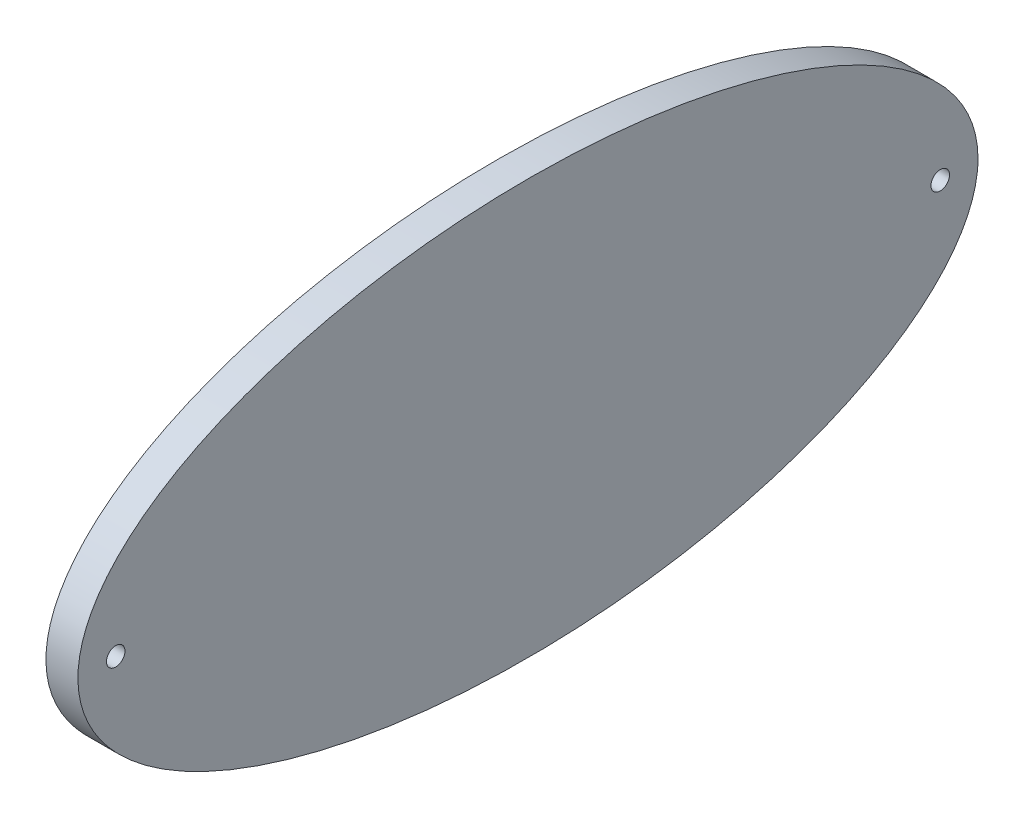
ISO-10303-21;
HEADER;
FILE_DESCRIPTION(('STEP AP214'),'2;1');
FILE_NAME('part.step','',(''),(''),'','','');
FILE_SCHEMA(('AUTOMOTIVE_DESIGN { 1 0 10303 214 1 1 1 1 }'));
ENDSEC;
DATA;
#1=APPLICATION_CONTEXT('core data for automotive mechanical design processes');
#2=APPLICATION_PROTOCOL_DEFINITION('international standard','automotive_design',2000,#1);
#3=PRODUCT_CONTEXT('',#1,'mechanical');
#4=PRODUCT('Part','Part','',(#3));
#5=PRODUCT_RELATED_PRODUCT_CATEGORY('part','',(#4));
#6=PRODUCT_DEFINITION_FORMATION('','',#4);
#7=PRODUCT_DEFINITION_CONTEXT('part definition',#1,'design');
#8=PRODUCT_DEFINITION('design','',#6,#7);
#9=PRODUCT_DEFINITION_SHAPE('','',#8);
#10=(LENGTH_UNIT() NAMED_UNIT(*) SI_UNIT(.MILLI.,.METRE.));
#11=(NAMED_UNIT(*) PLANE_ANGLE_UNIT() SI_UNIT($,.RADIAN.));
#12=(NAMED_UNIT(*) SI_UNIT($,.STERADIAN.) SOLID_ANGLE_UNIT());
#13=UNCERTAINTY_MEASURE_WITH_UNIT(LENGTH_MEASURE(1.E-05),#10,'distance_accuracy_value','');
#14=(GEOMETRIC_REPRESENTATION_CONTEXT(3) GLOBAL_UNCERTAINTY_ASSIGNED_CONTEXT((#13)) GLOBAL_UNIT_ASSIGNED_CONTEXT((#10,
#11,#12)) REPRESENTATION_CONTEXT('',''));
#15=CARTESIAN_POINT('',(0.,0.,0.));
#16=DIRECTION('',(0.,0.,1.));
#17=DIRECTION('',(1.,0.,0.));
#18=AXIS2_PLACEMENT_3D('',#15,#16,#17);
#19=CARTESIAN_POINT('',(5.08,0.,0.));
#20=DIRECTION('',(1.,0.,0.));
#21=DIRECTION('',(0.,0.,-1.));
#22=AXIS2_PLACEMENT_3D('',#19,#20,#21);
#23=PLANE('',#22);
#24=CARTESIAN_POINT('',(5.08,0.,65.5));
#25=DIRECTION('',(1.,0.,0.));
#26=DIRECTION('',(0.,0.,-1.));
#27=AXIS2_PLACEMENT_3D('',#24,#25,#26);
#28=CIRCLE('',#27,1.4732);
#29=CARTESIAN_POINT('',(5.08,0.,64.0268));
#30=VERTEX_POINT('',#29);
#31=EDGE_CURVE('E42',#30,#30,#28,.T.);
#32=ORIENTED_EDGE('',*,*,#31,.F.);
#33=EDGE_LOOP('',(#32));
#34=FACE_BOUND('',#33,.T.);
#35=CARTESIAN_POINT('',(5.08,0.,0.));
#36=DIRECTION('',(1.,0.,0.));
#37=DIRECTION('',(0.,0.,-1.));
#38=AXIS2_PLACEMENT_3D('',#35,#36,#37);
#39=ELLIPSE('',#38,71.5,32.95);
#40=CARTESIAN_POINT('',(5.08,0.,-71.5));
#41=VERTEX_POINT('',#40);
#42=EDGE_CURVE('E10',#41,#41,#39,.T.);
#43=ORIENTED_EDGE('',*,*,#42,.T.);
#44=EDGE_LOOP('',(#43));
#45=FACE_BOUND('',#44,.T.);
#46=CARTESIAN_POINT('',(5.08,0.,-65.5));
#47=DIRECTION('',(1.,0.,0.));
#48=DIRECTION('',(0.,0.,-1.));
#49=AXIS2_PLACEMENT_3D('',#46,#47,#48);
#50=CIRCLE('',#49,1.47320000000001);
#51=CARTESIAN_POINT('',(5.08,0.,-66.9732));
#52=VERTEX_POINT('',#51);
#53=EDGE_CURVE('E48',#52,#52,#50,.T.);
#54=ORIENTED_EDGE('',*,*,#53,.F.);
#55=EDGE_LOOP('',(#54));
#56=FACE_BOUND('',#55,.T.);
#57=ADVANCED_FACE('F31',(#34,#45,#56),#23,.T.);
#58=CARTESIAN_POINT('',(0.,0.,0.));
#59=DIRECTION('',(1.,0.,0.));
#60=DIRECTION('',(0.,0.,-1.));
#61=AXIS2_PLACEMENT_3D('',#58,#59,#60);
#62=PLANE('',#61);
#63=CARTESIAN_POINT('',(0.,0.,0.));
#64=DIRECTION('',(1.,0.,0.));
#65=DIRECTION('',(0.,0.,-1.));
#66=AXIS2_PLACEMENT_3D('',#63,#64,#65);
#67=ELLIPSE('',#66,71.5,32.95);
#68=CARTESIAN_POINT('',(0.,0.,-71.5));
#69=VERTEX_POINT('',#68);
#70=EDGE_CURVE('E36',#69,#69,#67,.T.);
#71=ORIENTED_EDGE('',*,*,#70,.F.);
#72=EDGE_LOOP('',(#71));
#73=FACE_BOUND('',#72,.T.);
#74=CARTESIAN_POINT('',(0.,0.,65.5));
#75=DIRECTION('',(1.,0.,0.));
#76=DIRECTION('',(0.,0.,-1.));
#77=AXIS2_PLACEMENT_3D('',#74,#75,#76);
#78=CIRCLE('',#77,1.4732);
#79=CARTESIAN_POINT('',(0.,0.,64.0268));
#80=VERTEX_POINT('',#79);
#81=EDGE_CURVE('E45',#80,#80,#78,.T.);
#82=ORIENTED_EDGE('',*,*,#81,.T.);
#83=EDGE_LOOP('',(#82));
#84=FACE_BOUND('',#83,.T.);
#85=CARTESIAN_POINT('',(0.,0.,-65.5));
#86=DIRECTION('',(1.,0.,0.));
#87=DIRECTION('',(0.,0.,-1.));
#88=AXIS2_PLACEMENT_3D('',#85,#86,#87);
#89=CIRCLE('',#88,1.47320000000001);
#90=CARTESIAN_POINT('',(0.,0.,-66.9732));
#91=VERTEX_POINT('',#90);
#92=EDGE_CURVE('E51',#91,#91,#89,.T.);
#93=ORIENTED_EDGE('',*,*,#92,.T.);
#94=EDGE_LOOP('',(#93));
#95=FACE_BOUND('',#94,.T.);
#96=ADVANCED_FACE('F61',(#73,#84,#95),#62,.F.);
#97=DIRECTION('',(-1.,0.,0.));
#98=VECTOR('',#97,1.);
#99=SURFACE_OF_LINEAR_EXTRUSION('',#39,#98);
#100=ORIENTED_EDGE('',*,*,#42,.F.);
#101=EDGE_LOOP('',(#100));
#102=FACE_BOUND('',#101,.T.);
#103=ORIENTED_EDGE('',*,*,#70,.T.);
#104=EDGE_LOOP('',(#103));
#105=FACE_BOUND('',#104,.T.);
#106=ADVANCED_FACE('F33',(#102,#105),#99,.F.);
#107=CARTESIAN_POINT('',(5.08,0.,65.5));
#108=DIRECTION('',(-1.,0.,0.));
#109=DIRECTION('',(0.,0.,1.));
#110=AXIS2_PLACEMENT_3D('',#107,#108,#109);
#111=CYLINDRICAL_SURFACE('',#110,1.4732);
#112=ORIENTED_EDGE('',*,*,#31,.T.);
#113=EDGE_LOOP('',(#112));
#114=FACE_BOUND('',#113,.T.);
#115=ORIENTED_EDGE('',*,*,#81,.F.);
#116=EDGE_LOOP('',(#115));
#117=FACE_BOUND('',#116,.T.);
#118=ADVANCED_FACE('F70',(#114,#117),#111,.F.);
#119=CARTESIAN_POINT('',(5.08,0.,-65.5));
#120=DIRECTION('',(-1.,0.,0.));
#121=DIRECTION('',(0.,0.,1.));
#122=AXIS2_PLACEMENT_3D('',#119,#120,#121);
#123=CYLINDRICAL_SURFACE('',#122,1.47320000000001);
#124=ORIENTED_EDGE('',*,*,#53,.T.);
#125=EDGE_LOOP('',(#124));
#126=FACE_BOUND('',#125,.T.);
#127=ORIENTED_EDGE('',*,*,#92,.F.);
#128=EDGE_LOOP('',(#127));
#129=FACE_BOUND('',#128,.T.);
#130=ADVANCED_FACE('F57',(#126,#129),#123,.F.);
#131=CLOSED_SHELL('',(#57,#96,#106,#118,#130));
#132=MANIFOLD_SOLID_BREP('B2',#131);
#133=ADVANCED_BREP_SHAPE_REPRESENTATION('',(#18,#132),#14);
#134=SHAPE_DEFINITION_REPRESENTATION(#9,#133);
ENDSEC;
END-ISO-10303-21;
